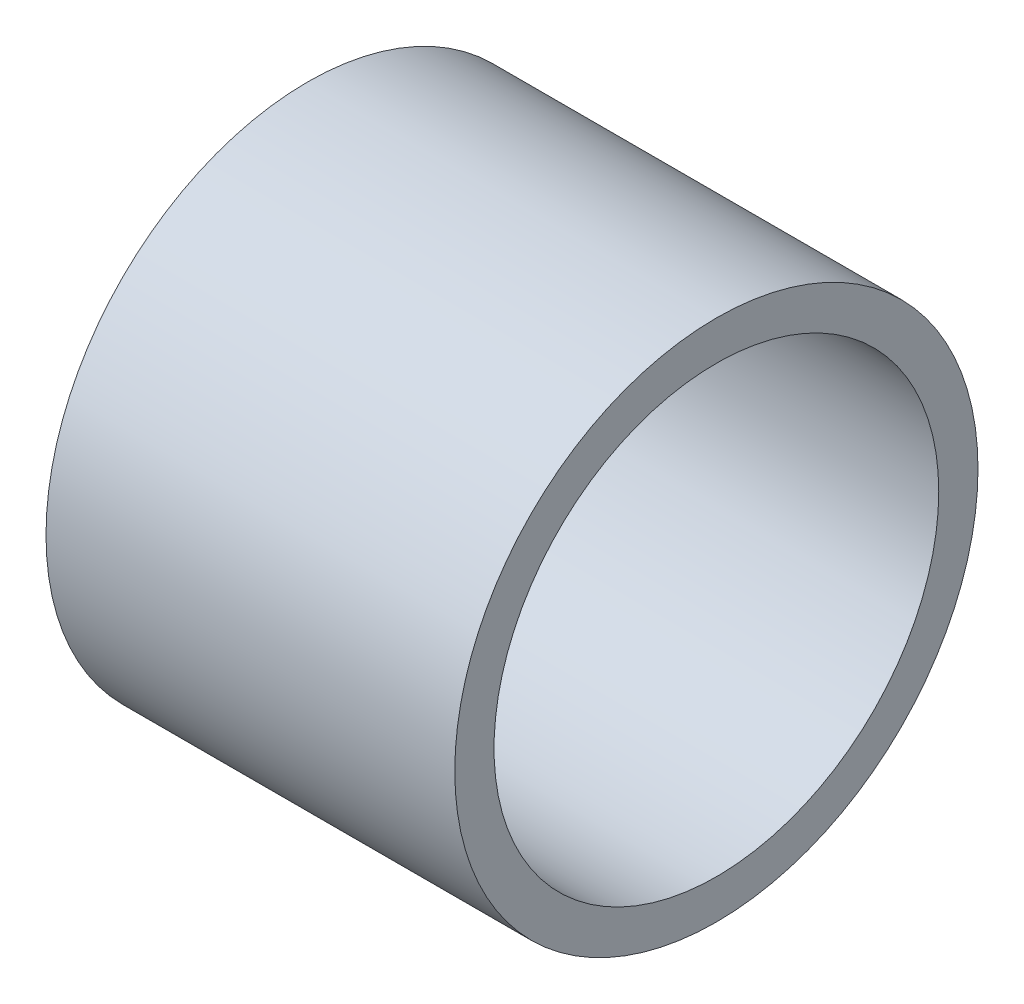
ISO-10303-21;
HEADER;
FILE_DESCRIPTION(('STEP AP214'),'2;1');
FILE_NAME('part.step','',(''),(''),'','','');
FILE_SCHEMA(('AUTOMOTIVE_DESIGN { 1 0 10303 214 1 1 1 1 }'));
ENDSEC;
DATA;
#1=APPLICATION_CONTEXT('core data for automotive mechanical design processes');
#2=APPLICATION_PROTOCOL_DEFINITION('international standard','automotive_design',2000,#1);
#3=PRODUCT_CONTEXT('',#1,'mechanical');
#4=PRODUCT('Part','Part','',(#3));
#5=PRODUCT_RELATED_PRODUCT_CATEGORY('part','',(#4));
#6=PRODUCT_DEFINITION_FORMATION('','',#4);
#7=PRODUCT_DEFINITION_CONTEXT('part definition',#1,'design');
#8=PRODUCT_DEFINITION('design','',#6,#7);
#9=PRODUCT_DEFINITION_SHAPE('','',#8);
#10=(LENGTH_UNIT() NAMED_UNIT(*) SI_UNIT(.MILLI.,.METRE.));
#11=(NAMED_UNIT(*) PLANE_ANGLE_UNIT() SI_UNIT($,.RADIAN.));
#12=(NAMED_UNIT(*) SI_UNIT($,.STERADIAN.) SOLID_ANGLE_UNIT());
#13=UNCERTAINTY_MEASURE_WITH_UNIT(LENGTH_MEASURE(1.E-05),#10,'distance_accuracy_value','');
#14=(GEOMETRIC_REPRESENTATION_CONTEXT(3) GLOBAL_UNCERTAINTY_ASSIGNED_CONTEXT((#13)) GLOBAL_UNIT_ASSIGNED_CONTEXT((#10,
#11,#12)) REPRESENTATION_CONTEXT('',''));
#15=CARTESIAN_POINT('',(0.,0.,0.));
#16=DIRECTION('',(0.,0.,1.));
#17=DIRECTION('',(1.,0.,0.));
#18=AXIS2_PLACEMENT_3D('',#15,#16,#17);
#19=CARTESIAN_POINT('',(25.,0.,0.));
#20=DIRECTION('',(1.,0.,0.));
#21=DIRECTION('',(0.,0.,-1.));
#22=AXIS2_PLACEMENT_3D('',#19,#20,#21);
#23=PLANE('',#22);
#24=CARTESIAN_POINT('',(25.,0.,0.));
#25=DIRECTION('',(1.,0.,0.));
#26=DIRECTION('',(0.,0.,-1.));
#27=AXIS2_PLACEMENT_3D('',#24,#25,#26);
#28=CIRCLE('',#27,16.);
#29=CARTESIAN_POINT('',(25.,0.,-16.));
#30=VERTEX_POINT('',#29);
#31=EDGE_CURVE('E10',#30,#30,#28,.T.);
#32=ORIENTED_EDGE('',*,*,#31,.T.);
#33=EDGE_LOOP('',(#32));
#34=FACE_BOUND('',#33,.T.);
#35=CARTESIAN_POINT('',(25.,0.,0.));
#36=DIRECTION('',(1.,0.,0.));
#37=DIRECTION('',(0.,0.,-1.));
#38=AXIS2_PLACEMENT_3D('',#35,#36,#37);
#39=CIRCLE('',#38,13.6);
#40=CARTESIAN_POINT('',(25.,0.,-13.6));
#41=VERTEX_POINT('',#40);
#42=EDGE_CURVE('E46',#41,#41,#39,.T.);
#43=ORIENTED_EDGE('',*,*,#42,.F.);
#44=EDGE_LOOP('',(#43));
#45=FACE_BOUND('',#44,.T.);
#46=ADVANCED_FACE('F35',(#34,#45),#23,.T.);
#47=CARTESIAN_POINT('',(0.,0.,0.));
#48=DIRECTION('',(1.,0.,0.));
#49=DIRECTION('',(0.,0.,-1.));
#50=AXIS2_PLACEMENT_3D('',#47,#48,#49);
#51=PLANE('',#50);
#52=CARTESIAN_POINT('',(0.,0.,0.));
#53=DIRECTION('',(1.,0.,0.));
#54=DIRECTION('',(0.,0.,-1.));
#55=AXIS2_PLACEMENT_3D('',#52,#53,#54);
#56=CIRCLE('',#55,16.);
#57=CARTESIAN_POINT('',(0.,0.,-16.));
#58=VERTEX_POINT('',#57);
#59=EDGE_CURVE('E39',#58,#58,#56,.T.);
#60=ORIENTED_EDGE('',*,*,#59,.F.);
#61=EDGE_LOOP('',(#60));
#62=FACE_BOUND('',#61,.T.);
#63=CARTESIAN_POINT('',(0.,0.,0.));
#64=DIRECTION('',(1.,0.,0.));
#65=DIRECTION('',(0.,0.,-1.));
#66=AXIS2_PLACEMENT_3D('',#63,#64,#65);
#67=CIRCLE('',#66,13.6);
#68=CARTESIAN_POINT('',(0.,0.,-13.6));
#69=VERTEX_POINT('',#68);
#70=EDGE_CURVE('E48',#69,#69,#67,.T.);
#71=ORIENTED_EDGE('',*,*,#70,.T.);
#72=EDGE_LOOP('',(#71));
#73=FACE_BOUND('',#72,.T.);
#74=ADVANCED_FACE('F58',(#62,#73),#51,.F.);
#75=CARTESIAN_POINT('',(25.,0.,0.));
#76=DIRECTION('',(-1.,0.,0.));
#77=DIRECTION('',(0.,0.,1.));
#78=AXIS2_PLACEMENT_3D('',#75,#76,#77);
#79=CYLINDRICAL_SURFACE('',#78,16.);
#80=ORIENTED_EDGE('',*,*,#31,.F.);
#81=EDGE_LOOP('',(#80));
#82=FACE_BOUND('',#81,.T.);
#83=ORIENTED_EDGE('',*,*,#59,.T.);
#84=EDGE_LOOP('',(#83));
#85=FACE_BOUND('',#84,.T.);
#86=ADVANCED_FACE('F37',(#82,#85),#79,.T.);
#87=CARTESIAN_POINT('',(25.,0.,0.));
#88=DIRECTION('',(-1.,0.,0.));
#89=DIRECTION('',(0.,0.,1.));
#90=AXIS2_PLACEMENT_3D('',#87,#88,#89);
#91=CYLINDRICAL_SURFACE('',#90,13.6);
#92=ORIENTED_EDGE('',*,*,#42,.T.);
#93=EDGE_LOOP('',(#92));
#94=FACE_BOUND('',#93,.T.);
#95=ORIENTED_EDGE('',*,*,#70,.F.);
#96=EDGE_LOOP('',(#95));
#97=FACE_BOUND('',#96,.T.);
#98=ADVANCED_FACE('F54',(#94,#97),#91,.F.);
#99=CLOSED_SHELL('',(#46,#74,#86,#98));
#100=MANIFOLD_SOLID_BREP('B2',#99);
#101=ADVANCED_BREP_SHAPE_REPRESENTATION('',(#18,#100),#14);
#102=SHAPE_DEFINITION_REPRESENTATION(#9,#101);
ENDSEC;
END-ISO-10303-21;
